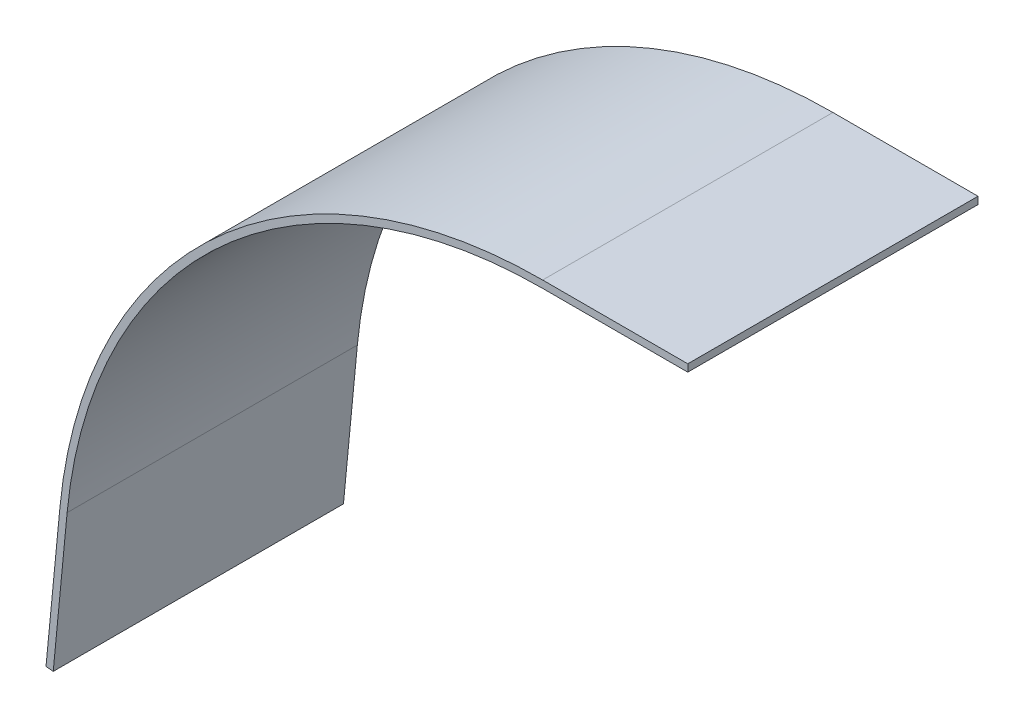
ISO-10303-21;
HEADER;
FILE_DESCRIPTION(('STEP AP214'),'2;1');
FILE_NAME('part.step','',(''),(''),'','','');
FILE_SCHEMA(('AUTOMOTIVE_DESIGN { 1 0 10303 214 1 1 1 1 }'));
ENDSEC;
DATA;
#1=APPLICATION_CONTEXT('core data for automotive mechanical design processes');
#2=APPLICATION_PROTOCOL_DEFINITION('international standard','automotive_design',2000,#1);
#3=PRODUCT_CONTEXT('',#1,'mechanical');
#4=PRODUCT('Part','Part','',(#3));
#5=PRODUCT_RELATED_PRODUCT_CATEGORY('part','',(#4));
#6=PRODUCT_DEFINITION_FORMATION('','',#4);
#7=PRODUCT_DEFINITION_CONTEXT('part definition',#1,'design');
#8=PRODUCT_DEFINITION('design','',#6,#7);
#9=PRODUCT_DEFINITION_SHAPE('','',#8);
#10=(LENGTH_UNIT() NAMED_UNIT(*) SI_UNIT(.MILLI.,.METRE.));
#11=(NAMED_UNIT(*) PLANE_ANGLE_UNIT() SI_UNIT($,.RADIAN.));
#12=(NAMED_UNIT(*) SI_UNIT($,.STERADIAN.) SOLID_ANGLE_UNIT());
#13=UNCERTAINTY_MEASURE_WITH_UNIT(LENGTH_MEASURE(1.E-05),#10,'distance_accuracy_value','');
#14=(GEOMETRIC_REPRESENTATION_CONTEXT(3) GLOBAL_UNCERTAINTY_ASSIGNED_CONTEXT((#13)) GLOBAL_UNIT_ASSIGNED_CONTEXT((#10,
#11,#12)) REPRESENTATION_CONTEXT('',''));
#15=CARTESIAN_POINT('',(0.,0.,0.));
#16=DIRECTION('',(0.,0.,1.));
#17=DIRECTION('',(1.,0.,0.));
#18=AXIS2_PLACEMENT_3D('',#15,#16,#17);
#19=CARTESIAN_POINT('',(-34.2245390273086,-39.9241613772917,-20.));
#20=DIRECTION('',(-0.99540431319491,0.0957614393843842,0.));
#21=DIRECTION('',(-0.0957614393843842,-0.99540431319491,0.));
#22=AXIS2_PLACEMENT_3D('',#19,#20,#21);
#23=PLANE('',#22);
#24=DIRECTION('',(-0.0957614393843842,-0.99540431319491,0.));
#25=VECTOR('',#24,1.);
#26=CARTESIAN_POINT('',(-34.2245390273086,-39.9241613772917,0.));
#27=LINE('',#26,#25);
#28=CARTESIAN_POINT('',(-33.2669246334648,-29.9701182453426,0.));
#29=VERTEX_POINT('',#28);
#30=CARTESIAN_POINT('',(-34.2245390273086,-39.9241613772917,0.));
#31=VERTEX_POINT('',#30);
#32=EDGE_CURVE('E139',#29,#31,#27,.T.);
#33=ORIENTED_EDGE('',*,*,#32,.F.);
#34=DIRECTION('',(0.,0.,1.));
#35=VECTOR('',#34,1.);
#36=CARTESIAN_POINT('',(-33.2669246334648,-29.9701182453426,-20.));
#37=LINE('',#36,#35);
#38=CARTESIAN_POINT('',(-33.2669246334648,-29.9701182453426,-20.));
#39=VERTEX_POINT('',#38);
#40=EDGE_CURVE('E11',#39,#29,#37,.T.);
#41=ORIENTED_EDGE('',*,*,#40,.F.);
#42=DIRECTION('',(-0.0957614393843842,-0.99540431319491,0.));
#43=VECTOR('',#42,1.);
#44=CARTESIAN_POINT('',(-34.2245390273086,-39.9241613772917,-20.));
#45=LINE('',#44,#43);
#46=CARTESIAN_POINT('',(-34.2245390273086,-39.9241613772917,-20.));
#47=VERTEX_POINT('',#46);
#48=EDGE_CURVE('E161',#39,#47,#45,.T.);
#49=ORIENTED_EDGE('',*,*,#48,.T.);
#50=DIRECTION('',(0.,0.,1.));
#51=VECTOR('',#50,1.);
#52=CARTESIAN_POINT('',(-34.2245390273086,-39.9241613772917,-20.));
#53=LINE('',#52,#51);
#54=EDGE_CURVE('E44',#47,#31,#53,.T.);
#55=ORIENTED_EDGE('',*,*,#54,.T.);
#56=EDGE_LOOP('',(#33,#41,#49,#55));
#57=FACE_BOUND('',#56,.T.);
#58=ADVANCED_FACE('F41',(#57),#23,.T.);
#59=CARTESIAN_POINT('',(5.99520433297585E-12,-33.1705148525947,-20.));
#60=DIRECTION('',(0.,0.,1.));
#61=DIRECTION('',(1.,0.,0.));
#62=AXIS2_PLACEMENT_3D('',#59,#60,#61);
#63=CYLINDRICAL_SURFACE('',#62,33.4205148525982);
#64=CARTESIAN_POINT('',(5.99520433297585E-12,-33.1705148525947,0.));
#65=DIRECTION('',(0.,0.,1.));
#66=DIRECTION('',(1.,0.,0.));
#67=AXIS2_PLACEMENT_3D('',#64,#65,#66);
#68=CIRCLE('',#67,33.4205148525982);
#69=CARTESIAN_POINT('',(5.98906508399483E-12,0.250000000003442,0.));
#70=VERTEX_POINT('',#69);
#71=EDGE_CURVE('E158',#70,#29,#68,.T.);
#72=ORIENTED_EDGE('',*,*,#71,.F.);
#73=DIRECTION('',(0.,0.,1.));
#74=VECTOR('',#73,1.);
#75=CARTESIAN_POINT('',(5.98906508399483E-12,0.250000000003442,-20.));
#76=LINE('',#75,#74);
#77=CARTESIAN_POINT('',(5.98906508399483E-12,0.250000000003442,-20.));
#78=VERTEX_POINT('',#77);
#79=EDGE_CURVE('E50',#78,#70,#76,.T.);
#80=ORIENTED_EDGE('',*,*,#79,.F.);
#81=CARTESIAN_POINT('',(5.99520433297585E-12,-33.1705148525947,-20.));
#82=DIRECTION('',(0.,0.,1.));
#83=DIRECTION('',(1.,0.,0.));
#84=AXIS2_PLACEMENT_3D('',#81,#82,#83);
#85=CIRCLE('',#84,33.4205148525982);
#86=EDGE_CURVE('E128',#78,#39,#85,.T.);
#87=ORIENTED_EDGE('',*,*,#86,.T.);
#88=ORIENTED_EDGE('',*,*,#40,.T.);
#89=EDGE_LOOP('',(#72,#80,#87,#88));
#90=FACE_BOUND('',#89,.T.);
#91=ADVANCED_FACE('F173',(#90),#63,.T.);
#92=CARTESIAN_POINT('',(10.0000000000055,0.250000000003442,-20.));
#93=DIRECTION('',(0.,1.,0.));
#94=DIRECTION('',(-1.,0.,0.));
#95=AXIS2_PLACEMENT_3D('',#92,#93,#94);
#96=PLANE('',#95);
#97=DIRECTION('',(-1.,0.,0.));
#98=VECTOR('',#97,1.);
#99=CARTESIAN_POINT('',(10.0000000000055,0.250000000003442,0.));
#100=LINE('',#99,#98);
#101=CARTESIAN_POINT('',(10.0000000000055,0.250000000003442,0.));
#102=VERTEX_POINT('',#101);
#103=EDGE_CURVE('E115',#102,#70,#100,.T.);
#104=ORIENTED_EDGE('',*,*,#103,.F.);
#105=DIRECTION('',(0.,0.,1.));
#106=VECTOR('',#105,1.);
#107=CARTESIAN_POINT('',(10.0000000000055,0.250000000003442,-20.));
#108=LINE('',#107,#106);
#109=CARTESIAN_POINT('',(10.0000000000055,0.250000000003442,-20.));
#110=VERTEX_POINT('',#109);
#111=EDGE_CURVE('E110',#110,#102,#108,.T.);
#112=ORIENTED_EDGE('',*,*,#111,.F.);
#113=DIRECTION('',(-1.,0.,0.));
#114=VECTOR('',#113,1.);
#115=CARTESIAN_POINT('',(10.0000000000055,0.250000000003442,-20.));
#116=LINE('',#115,#114);
#117=EDGE_CURVE('E113',#110,#78,#116,.T.);
#118=ORIENTED_EDGE('',*,*,#117,.T.);
#119=ORIENTED_EDGE('',*,*,#79,.T.);
#120=EDGE_LOOP('',(#104,#112,#118,#119));
#121=FACE_BOUND('',#120,.T.);
#122=ADVANCED_FACE('F112',(#121),#96,.T.);
#123=CARTESIAN_POINT('',(10.0000000000055,-0.249999999996558,-20.));
#124=DIRECTION('',(1.,0.,0.));
#125=DIRECTION('',(0.,0.,-1.));
#126=AXIS2_PLACEMENT_3D('',#123,#124,#125);
#127=PLANE('',#126);
#128=DIRECTION('',(0.,1.,0.));
#129=VECTOR('',#128,1.);
#130=CARTESIAN_POINT('',(10.0000000000055,-0.249999999996558,0.));
#131=LINE('',#130,#129);
#132=CARTESIAN_POINT('',(10.0000000000055,-0.249999999996558,0.));
#133=VERTEX_POINT('',#132);
#134=EDGE_CURVE('E155',#133,#102,#131,.T.);
#135=ORIENTED_EDGE('',*,*,#134,.F.);
#136=DIRECTION('',(0.,0.,1.));
#137=VECTOR('',#136,1.);
#138=CARTESIAN_POINT('',(10.0000000000055,-0.249999999996558,-20.));
#139=LINE('',#138,#137);
#140=CARTESIAN_POINT('',(10.0000000000055,-0.249999999996558,-20.));
#141=VERTEX_POINT('',#140);
#142=EDGE_CURVE('E120',#141,#133,#139,.T.);
#143=ORIENTED_EDGE('',*,*,#142,.F.);
#144=DIRECTION('',(0.,1.,0.));
#145=VECTOR('',#144,1.);
#146=CARTESIAN_POINT('',(10.0000000000055,-0.249999999996558,-20.));
#147=LINE('',#146,#145);
#148=EDGE_CURVE('E126',#141,#110,#147,.T.);
#149=ORIENTED_EDGE('',*,*,#148,.T.);
#150=ORIENTED_EDGE('',*,*,#111,.T.);
#151=EDGE_LOOP('',(#135,#143,#149,#150));
#152=FACE_BOUND('',#151,.T.);
#153=ADVANCED_FACE('F130',(#152),#127,.T.);
#154=CARTESIAN_POINT('',(10.0000000000055,-0.249999999996558,-20.));
#155=DIRECTION('',(0.,-1.,0.));
#156=DIRECTION('',(1.,0.,0.));
#157=AXIS2_PLACEMENT_3D('',#154,#155,#156);
#158=PLANE('',#157);
#159=DIRECTION('',(1.,0.,0.));
#160=VECTOR('',#159,1.);
#161=CARTESIAN_POINT('',(10.0000000000055,-0.249999999996558,0.));
#162=LINE('',#161,#160);
#163=CARTESIAN_POINT('',(6.0344509674318E-12,-0.249999999996559,0.));
#164=VERTEX_POINT('',#163);
#165=EDGE_CURVE('E152',#164,#133,#162,.T.);
#166=ORIENTED_EDGE('',*,*,#165,.F.);
#167=DIRECTION('',(0.,0.,1.));
#168=VECTOR('',#167,1.);
#169=CARTESIAN_POINT('',(6.0344509674318E-12,-0.249999999996559,-20.));
#170=LINE('',#169,#168);
#171=CARTESIAN_POINT('',(6.0344509674318E-12,-0.249999999996559,-20.));
#172=VERTEX_POINT('',#171);
#173=EDGE_CURVE('E165',#172,#164,#170,.T.);
#174=ORIENTED_EDGE('',*,*,#173,.F.);
#175=DIRECTION('',(1.,0.,0.));
#176=VECTOR('',#175,1.);
#177=CARTESIAN_POINT('',(10.0000000000055,-0.249999999996558,-20.));
#178=LINE('',#177,#176);
#179=EDGE_CURVE('E131',#172,#141,#178,.T.);
#180=ORIENTED_EDGE('',*,*,#179,.T.);
#181=ORIENTED_EDGE('',*,*,#142,.T.);
#182=EDGE_LOOP('',(#166,#174,#180,#181));
#183=FACE_BOUND('',#182,.T.);
#184=ADVANCED_FACE('F186',(#183),#158,.T.);
#185=CARTESIAN_POINT('',(6.0437765903032E-12,-33.1705148525947,-20.));
#186=DIRECTION('',(0.,0.,1.));
#187=DIRECTION('',(1.,0.,0.));
#188=AXIS2_PLACEMENT_3D('',#185,#186,#187);
#189=CYLINDRICAL_SURFACE('',#188,32.9205148525982);
#190=CARTESIAN_POINT('',(6.0437765903032E-12,-33.1705148525947,0.));
#191=DIRECTION('',(0.,0.,-1.));
#192=DIRECTION('',(-1.,0.,0.));
#193=AXIS2_PLACEMENT_3D('',#190,#191,#192);
#194=CIRCLE('',#193,32.9205148525982);
#195=CARTESIAN_POINT('',(-32.7692224768673,-30.0179989650348,0.));
#196=VERTEX_POINT('',#195);
#197=EDGE_CURVE('E148',#196,#164,#194,.T.);
#198=ORIENTED_EDGE('',*,*,#197,.F.);
#199=DIRECTION('',(0.,0.,1.));
#200=VECTOR('',#199,1.);
#201=CARTESIAN_POINT('',(-32.7692224768673,-30.0179989650348,-20.));
#202=LINE('',#201,#200);
#203=CARTESIAN_POINT('',(-32.7692224768673,-30.0179989650348,-20.));
#204=VERTEX_POINT('',#203);
#205=EDGE_CURVE('E167',#204,#196,#202,.T.);
#206=ORIENTED_EDGE('',*,*,#205,.F.);
#207=CARTESIAN_POINT('',(6.0437765903032E-12,-33.1705148525947,-20.));
#208=DIRECTION('',(0.,0.,-1.));
#209=DIRECTION('',(-1.,0.,0.));
#210=AXIS2_PLACEMENT_3D('',#207,#208,#209);
#211=CIRCLE('',#210,32.9205148525982);
#212=EDGE_CURVE('E133',#204,#172,#211,.T.);
#213=ORIENTED_EDGE('',*,*,#212,.T.);
#214=ORIENTED_EDGE('',*,*,#173,.T.);
#215=EDGE_LOOP('',(#198,#206,#213,#214));
#216=FACE_BOUND('',#215,.T.);
#217=ADVANCED_FACE('F189',(#216),#189,.F.);
#218=CARTESIAN_POINT('',(-33.7268368707111,-39.9720420969839,-20.));
#219=DIRECTION('',(0.99540431319491,-0.0957614393843884,0.));
#220=DIRECTION('',(0.0957614393843884,0.99540431319491,0.));
#221=AXIS2_PLACEMENT_3D('',#218,#219,#220);
#222=PLANE('',#221);
#223=DIRECTION('',(0.0957614393843884,0.99540431319491,0.));
#224=VECTOR('',#223,1.);
#225=CARTESIAN_POINT('',(-33.7268368707111,-39.9720420969839,0.));
#226=LINE('',#225,#224);
#227=CARTESIAN_POINT('',(-33.7268368707111,-39.9720420969839,0.));
#228=VERTEX_POINT('',#227);
#229=EDGE_CURVE('E145',#228,#196,#226,.T.);
#230=ORIENTED_EDGE('',*,*,#229,.F.);
#231=DIRECTION('',(0.,0.,1.));
#232=VECTOR('',#231,1.);
#233=CARTESIAN_POINT('',(-33.7268368707111,-39.9720420969839,-20.));
#234=LINE('',#233,#232);
#235=CARTESIAN_POINT('',(-33.7268368707111,-39.9720420969839,-20.));
#236=VERTEX_POINT('',#235);
#237=EDGE_CURVE('E168',#236,#228,#234,.T.);
#238=ORIENTED_EDGE('',*,*,#237,.F.);
#239=DIRECTION('',(0.0957614393843884,0.99540431319491,0.));
#240=VECTOR('',#239,1.);
#241=CARTESIAN_POINT('',(-33.7268368707111,-39.9720420969839,-20.));
#242=LINE('',#241,#240);
#243=EDGE_CURVE('E264',#236,#204,#242,.T.);
#244=ORIENTED_EDGE('',*,*,#243,.T.);
#245=ORIENTED_EDGE('',*,*,#205,.T.);
#246=EDGE_LOOP('',(#230,#238,#244,#245));
#247=FACE_BOUND('',#246,.T.);
#248=ADVANCED_FACE('F193',(#247),#222,.T.);
#249=CARTESIAN_POINT('',(-34.2245390273086,-39.9241613772917,-20.));
#250=DIRECTION('',(-0.0957614393843888,-0.99540431319491,0.));
#251=DIRECTION('',(0.99540431319491,-0.0957614393843888,0.));
#252=AXIS2_PLACEMENT_3D('',#249,#250,#251);
#253=PLANE('',#252);
#254=DIRECTION('',(0.99540431319491,-0.0957614393843888,0.));
#255=VECTOR('',#254,1.);
#256=CARTESIAN_POINT('',(-34.2245390273086,-39.9241613772917,0.));
#257=LINE('',#256,#255);
#258=EDGE_CURVE('E142',#31,#228,#257,.T.);
#259=ORIENTED_EDGE('',*,*,#258,.F.);
#260=ORIENTED_EDGE('',*,*,#54,.F.);
#261=DIRECTION('',(0.99540431319491,-0.0957614393843888,0.));
#262=VECTOR('',#261,1.);
#263=CARTESIAN_POINT('',(-34.2245390273086,-39.9241613772917,-20.));
#264=LINE('',#263,#262);
#265=EDGE_CURVE('E266',#47,#236,#264,.T.);
#266=ORIENTED_EDGE('',*,*,#265,.T.);
#267=ORIENTED_EDGE('',*,*,#237,.T.);
#268=EDGE_LOOP('',(#259,#260,#266,#267));
#269=FACE_BOUND('',#268,.T.);
#270=ADVANCED_FACE('F170',(#269),#253,.T.);
#271=CARTESIAN_POINT('',(5.99520433297585E-12,-33.1705148525947,-20.));
#272=DIRECTION('',(0.,0.,1.));
#273=DIRECTION('',(1.,0.,0.));
#274=AXIS2_PLACEMENT_3D('',#271,#272,#273);
#275=PLANE('',#274);
#276=ORIENTED_EDGE('',*,*,#48,.F.);
#277=ORIENTED_EDGE('',*,*,#86,.F.);
#278=ORIENTED_EDGE('',*,*,#117,.F.);
#279=ORIENTED_EDGE('',*,*,#148,.F.);
#280=ORIENTED_EDGE('',*,*,#179,.F.);
#281=ORIENTED_EDGE('',*,*,#212,.F.);
#282=ORIENTED_EDGE('',*,*,#243,.F.);
#283=ORIENTED_EDGE('',*,*,#265,.F.);
#284=EDGE_LOOP('',(#276,#277,#278,#279,#280,#281,#282,#283));
#285=FACE_BOUND('',#284,.T.);
#286=ADVANCED_FACE('F124',(#285),#275,.F.);
#287=CARTESIAN_POINT('',(5.99520433297585E-12,-33.1705148525947,0.));
#288=DIRECTION('',(0.,0.,1.));
#289=DIRECTION('',(1.,0.,0.));
#290=AXIS2_PLACEMENT_3D('',#287,#288,#289);
#291=PLANE('',#290);
#292=ORIENTED_EDGE('',*,*,#32,.T.);
#293=ORIENTED_EDGE('',*,*,#258,.T.);
#294=ORIENTED_EDGE('',*,*,#229,.T.);
#295=ORIENTED_EDGE('',*,*,#197,.T.);
#296=ORIENTED_EDGE('',*,*,#165,.T.);
#297=ORIENTED_EDGE('',*,*,#134,.T.);
#298=ORIENTED_EDGE('',*,*,#103,.T.);
#299=ORIENTED_EDGE('',*,*,#71,.T.);
#300=EDGE_LOOP('',(#292,#293,#294,#295,#296,#297,#298,#299));
#301=FACE_BOUND('',#300,.T.);
#302=ADVANCED_FACE('F172',(#301),#291,.T.);
#303=CLOSED_SHELL('',(#58,#91,#122,#153,#184,#217,#248,#270,#286,#302));
#304=MANIFOLD_SOLID_BREP('B2',#303);
#305=ADVANCED_BREP_SHAPE_REPRESENTATION('',(#18,#304),#14);
#306=SHAPE_DEFINITION_REPRESENTATION(#9,#305);
ENDSEC;
END-ISO-10303-21;
